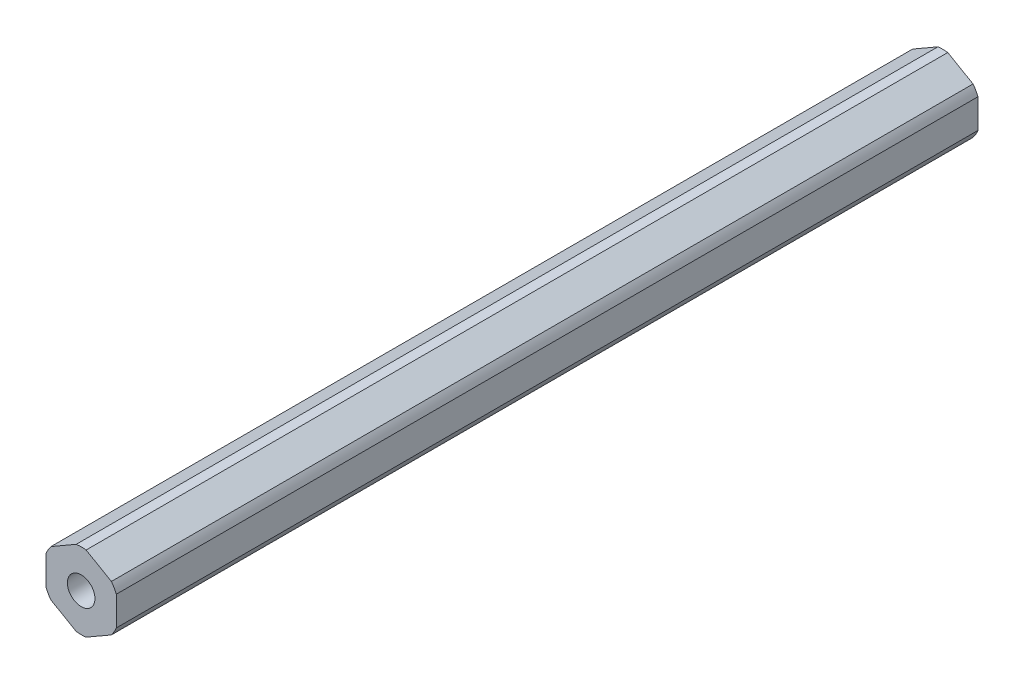
ISO-10303-21;
HEADER;
FILE_DESCRIPTION(('STEP AP214'),'2;1');
FILE_NAME('part.step','',(''),(''),'','','');
FILE_SCHEMA(('AUTOMOTIVE_DESIGN { 1 0 10303 214 1 1 1 1 }'));
ENDSEC;
DATA;
#1=APPLICATION_CONTEXT('core data for automotive mechanical design processes');
#2=APPLICATION_PROTOCOL_DEFINITION('international standard','automotive_design',2000,#1);
#3=PRODUCT_CONTEXT('',#1,'mechanical');
#4=PRODUCT('Part','Part','',(#3));
#5=PRODUCT_RELATED_PRODUCT_CATEGORY('part','',(#4));
#6=PRODUCT_DEFINITION_FORMATION('','',#4);
#7=PRODUCT_DEFINITION_CONTEXT('part definition',#1,'design');
#8=PRODUCT_DEFINITION('design','',#6,#7);
#9=PRODUCT_DEFINITION_SHAPE('','',#8);
#10=(LENGTH_UNIT() NAMED_UNIT(*) SI_UNIT(.MILLI.,.METRE.));
#11=(NAMED_UNIT(*) PLANE_ANGLE_UNIT() SI_UNIT($,.RADIAN.));
#12=(NAMED_UNIT(*) SI_UNIT($,.STERADIAN.) SOLID_ANGLE_UNIT());
#13=UNCERTAINTY_MEASURE_WITH_UNIT(LENGTH_MEASURE(1.E-05),#10,'distance_accuracy_value','');
#14=(GEOMETRIC_REPRESENTATION_CONTEXT(3) GLOBAL_UNCERTAINTY_ASSIGNED_CONTEXT((#13)) GLOBAL_UNIT_ASSIGNED_CONTEXT((#10,
#11,#12)) REPRESENTATION_CONTEXT('',''));
#15=CARTESIAN_POINT('',(0.,0.,0.));
#16=DIRECTION('',(0.,0.,1.));
#17=DIRECTION('',(1.,0.,0.));
#18=AXIS2_PLACEMENT_3D('',#15,#16,#17);
#19=CARTESIAN_POINT('',(0.,0.,-155.575));
#20=DIRECTION('',(0.,0.,1.));
#21=DIRECTION('',(1.,0.,0.));
#22=AXIS2_PLACEMENT_3D('',#19,#20,#21);
#23=CYLINDRICAL_SURFACE('',#22,6.875);
#24=CARTESIAN_POINT('',(0.,0.,0.));
#25=DIRECTION('',(0.,0.,1.));
#26=DIRECTION('',(1.,0.,0.));
#27=AXIS2_PLACEMENT_3D('',#24,#25,#26);
#28=CIRCLE('',#27,6.875);
#29=CARTESIAN_POINT('',(-5.45696050579321,4.18177080173138,0.));
#30=VERTEX_POINT('',#29);
#31=CARTESIAN_POINT('',(-6.35,2.6349810245996,0.));
#32=VERTEX_POINT('',#31);
#33=EDGE_CURVE('E172',#30,#32,#28,.T.);
#34=ORIENTED_EDGE('',*,*,#33,.F.);
#35=DIRECTION('',(0.,0.,1.));
#36=VECTOR('',#35,1.);
#37=CARTESIAN_POINT('',(-5.45696050579321,4.18177080173138,-155.575));
#38=LINE('',#37,#36);
#39=CARTESIAN_POINT('',(-5.45696050579321,4.18177080173138,-155.575));
#40=VERTEX_POINT('',#39);
#41=EDGE_CURVE('E11',#40,#30,#38,.T.);
#42=ORIENTED_EDGE('',*,*,#41,.F.);
#43=CARTESIAN_POINT('',(0.,0.,-155.575));
#44=DIRECTION('',(0.,0.,1.));
#45=DIRECTION('',(1.,0.,0.));
#46=AXIS2_PLACEMENT_3D('',#43,#44,#45);
#47=CIRCLE('',#46,6.875);
#48=CARTESIAN_POINT('',(-6.35,2.6349810245996,-155.575));
#49=VERTEX_POINT('',#48);
#50=EDGE_CURVE('E217',#40,#49,#47,.T.);
#51=ORIENTED_EDGE('',*,*,#50,.T.);
#52=DIRECTION('',(0.,0.,1.));
#53=VECTOR('',#52,1.);
#54=CARTESIAN_POINT('',(-6.35,2.6349810245996,-155.575));
#55=LINE('',#54,#53);
#56=EDGE_CURVE('E48',#49,#32,#55,.T.);
#57=ORIENTED_EDGE('',*,*,#56,.T.);
#58=EDGE_LOOP('',(#34,#42,#51,#57));
#59=FACE_BOUND('',#58,.T.);
#60=ADVANCED_FACE('F45',(#59),#23,.T.);
#61=CARTESIAN_POINT('',(-0.893039494206794,6.81675182633099,-155.575));
#62=DIRECTION('',(-0.500000000000001,0.866025403784438,0.));
#63=DIRECTION('',(-0.866025403784438,-0.500000000000001,0.));
#64=AXIS2_PLACEMENT_3D('',#61,#62,#63);
#65=PLANE('',#64);
#66=DIRECTION('',(-0.866025403784438,-0.500000000000001,0.));
#67=VECTOR('',#66,1.);
#68=CARTESIAN_POINT('',(-0.893039494206794,6.81675182633099,0.));
#69=LINE('',#68,#67);
#70=CARTESIAN_POINT('',(-0.893039494206795,6.81675182633099,0.));
#71=VERTEX_POINT('',#70);
#72=EDGE_CURVE('E214',#71,#30,#69,.T.);
#73=ORIENTED_EDGE('',*,*,#72,.F.);
#74=DIRECTION('',(0.,0.,1.));
#75=VECTOR('',#74,1.);
#76=CARTESIAN_POINT('',(-0.893039494206795,6.81675182633099,-155.575));
#77=LINE('',#76,#75);
#78=CARTESIAN_POINT('',(-0.893039494206795,6.81675182633099,-155.575));
#79=VERTEX_POINT('',#78);
#80=EDGE_CURVE('E55',#79,#71,#77,.T.);
#81=ORIENTED_EDGE('',*,*,#80,.F.);
#82=DIRECTION('',(-0.866025403784438,-0.500000000000001,0.));
#83=VECTOR('',#82,1.);
#84=CARTESIAN_POINT('',(-0.893039494206794,6.81675182633099,-155.575));
#85=LINE('',#84,#83);
#86=EDGE_CURVE('E158',#79,#40,#85,.T.);
#87=ORIENTED_EDGE('',*,*,#86,.T.);
#88=ORIENTED_EDGE('',*,*,#41,.T.);
#89=EDGE_LOOP('',(#73,#81,#87,#88));
#90=FACE_BOUND('',#89,.T.);
#91=ADVANCED_FACE('F247',(#90),#65,.T.);
#92=CARTESIAN_POINT('',(0.,0.,-155.575));
#93=DIRECTION('',(0.,0.,1.));
#94=DIRECTION('',(1.,0.,0.));
#95=AXIS2_PLACEMENT_3D('',#92,#93,#94);
#96=CYLINDRICAL_SURFACE('',#95,6.875);
#97=CARTESIAN_POINT('',(0.,0.,0.));
#98=DIRECTION('',(0.,0.,1.));
#99=DIRECTION('',(1.,0.,0.));
#100=AXIS2_PLACEMENT_3D('',#97,#98,#99);
#101=CIRCLE('',#100,6.875);
#102=CARTESIAN_POINT('',(0.893039494206794,6.81675182633099,0.));
#103=VERTEX_POINT('',#102);
#104=EDGE_CURVE('E144',#103,#71,#101,.T.);
#105=ORIENTED_EDGE('',*,*,#104,.F.);
#106=DIRECTION('',(0.,0.,1.));
#107=VECTOR('',#106,1.);
#108=CARTESIAN_POINT('',(0.893039494206794,6.81675182633099,-155.575));
#109=LINE('',#108,#107);
#110=CARTESIAN_POINT('',(0.893039494206794,6.81675182633099,-155.575));
#111=VERTEX_POINT('',#110);
#112=EDGE_CURVE('E139',#111,#103,#109,.T.);
#113=ORIENTED_EDGE('',*,*,#112,.F.);
#114=CARTESIAN_POINT('',(0.,0.,-155.575));
#115=DIRECTION('',(0.,0.,1.));
#116=DIRECTION('',(1.,0.,0.));
#117=AXIS2_PLACEMENT_3D('',#114,#115,#116);
#118=CIRCLE('',#117,6.875);
#119=EDGE_CURVE('E142',#111,#79,#118,.T.);
#120=ORIENTED_EDGE('',*,*,#119,.T.);
#121=ORIENTED_EDGE('',*,*,#80,.T.);
#122=EDGE_LOOP('',(#105,#113,#120,#121));
#123=FACE_BOUND('',#122,.T.);
#124=ADVANCED_FACE('F141',(#123),#96,.T.);
#125=CARTESIAN_POINT('',(5.45696050579321,4.18177080173139,-155.575));
#126=DIRECTION('',(0.5,0.866025403784439,0.));
#127=DIRECTION('',(-0.866025403784439,0.5,0.));
#128=AXIS2_PLACEMENT_3D('',#125,#126,#127);
#129=PLANE('',#128);
#130=DIRECTION('',(-0.866025403784439,0.5,0.));
#131=VECTOR('',#130,1.);
#132=CARTESIAN_POINT('',(5.45696050579321,4.18177080173139,0.));
#133=LINE('',#132,#131);
#134=CARTESIAN_POINT('',(5.45696050579321,4.18177080173139,0.));
#135=VERTEX_POINT('',#134);
#136=EDGE_CURVE('E209',#135,#103,#133,.T.);
#137=ORIENTED_EDGE('',*,*,#136,.F.);
#138=DIRECTION('',(0.,0.,1.));
#139=VECTOR('',#138,1.);
#140=CARTESIAN_POINT('',(5.45696050579321,4.18177080173139,-155.575));
#141=LINE('',#140,#139);
#142=CARTESIAN_POINT('',(5.45696050579321,4.18177080173139,-155.575));
#143=VERTEX_POINT('',#142);
#144=EDGE_CURVE('E150',#143,#135,#141,.T.);
#145=ORIENTED_EDGE('',*,*,#144,.F.);
#146=DIRECTION('',(-0.866025403784439,0.5,0.));
#147=VECTOR('',#146,1.);
#148=CARTESIAN_POINT('',(5.45696050579321,4.18177080173139,-155.575));
#149=LINE('',#148,#147);
#150=EDGE_CURVE('E156',#143,#111,#149,.T.);
#151=ORIENTED_EDGE('',*,*,#150,.T.);
#152=ORIENTED_EDGE('',*,*,#112,.T.);
#153=EDGE_LOOP('',(#137,#145,#151,#152));
#154=FACE_BOUND('',#153,.T.);
#155=ADVANCED_FACE('F161',(#154),#129,.T.);
#156=CARTESIAN_POINT('',(0.,0.,-155.575));
#157=DIRECTION('',(0.,0.,1.));
#158=DIRECTION('',(1.,0.,0.));
#159=AXIS2_PLACEMENT_3D('',#156,#157,#158);
#160=CYLINDRICAL_SURFACE('',#159,6.875);
#161=CARTESIAN_POINT('',(0.,0.,0.));
#162=DIRECTION('',(0.,0.,1.));
#163=DIRECTION('',(1.,0.,0.));
#164=AXIS2_PLACEMENT_3D('',#161,#162,#163);
#165=CIRCLE('',#164,6.875);
#166=CARTESIAN_POINT('',(6.35,2.6349810245996,0.));
#167=VERTEX_POINT('',#166);
#168=EDGE_CURVE('E205',#167,#135,#165,.T.);
#169=ORIENTED_EDGE('',*,*,#168,.F.);
#170=DIRECTION('',(0.,0.,1.));
#171=VECTOR('',#170,1.);
#172=CARTESIAN_POINT('',(6.35,2.6349810245996,-155.575));
#173=LINE('',#172,#171);
#174=CARTESIAN_POINT('',(6.35,2.6349810245996,-155.575));
#175=VERTEX_POINT('',#174);
#176=EDGE_CURVE('E223',#175,#167,#173,.T.);
#177=ORIENTED_EDGE('',*,*,#176,.F.);
#178=CARTESIAN_POINT('',(0.,0.,-155.575));
#179=DIRECTION('',(0.,0.,1.));
#180=DIRECTION('',(1.,0.,0.));
#181=AXIS2_PLACEMENT_3D('',#178,#179,#180);
#182=CIRCLE('',#181,6.875);
#183=EDGE_CURVE('E163',#175,#143,#182,.T.);
#184=ORIENTED_EDGE('',*,*,#183,.T.);
#185=ORIENTED_EDGE('',*,*,#144,.T.);
#186=EDGE_LOOP('',(#169,#177,#184,#185));
#187=FACE_BOUND('',#186,.T.);
#188=ADVANCED_FACE('F260',(#187),#160,.T.);
#189=CARTESIAN_POINT('',(6.35,-2.6349810245996,-155.575));
#190=DIRECTION('',(1.,0.,0.));
#191=DIRECTION('',(0.,0.,-1.));
#192=AXIS2_PLACEMENT_3D('',#189,#190,#191);
#193=PLANE('',#192);
#194=DIRECTION('',(0.,1.,0.));
#195=VECTOR('',#194,1.);
#196=CARTESIAN_POINT('',(6.35,-2.6349810245996,0.));
#197=LINE('',#196,#195);
#198=CARTESIAN_POINT('',(6.35,-2.6349810245996,0.));
#199=VERTEX_POINT('',#198);
#200=EDGE_CURVE('E201',#199,#167,#197,.T.);
#201=ORIENTED_EDGE('',*,*,#200,.F.);
#202=DIRECTION('',(0.,0.,1.));
#203=VECTOR('',#202,1.);
#204=CARTESIAN_POINT('',(6.35,-2.6349810245996,-155.575));
#205=LINE('',#204,#203);
#206=CARTESIAN_POINT('',(6.35,-2.6349810245996,-155.575));
#207=VERTEX_POINT('',#206);
#208=EDGE_CURVE('E226',#207,#199,#205,.T.);
#209=ORIENTED_EDGE('',*,*,#208,.F.);
#210=DIRECTION('',(0.,1.,0.));
#211=VECTOR('',#210,1.);
#212=CARTESIAN_POINT('',(6.35,-2.6349810245996,-155.575));
#213=LINE('',#212,#211);
#214=EDGE_CURVE('E166',#207,#175,#213,.T.);
#215=ORIENTED_EDGE('',*,*,#214,.T.);
#216=ORIENTED_EDGE('',*,*,#176,.T.);
#217=EDGE_LOOP('',(#201,#209,#215,#216));
#218=FACE_BOUND('',#217,.T.);
#219=ADVANCED_FACE('F263',(#218),#193,.T.);
#220=CARTESIAN_POINT('',(0.,0.,-155.575));
#221=DIRECTION('',(0.,0.,1.));
#222=DIRECTION('',(1.,0.,0.));
#223=AXIS2_PLACEMENT_3D('',#220,#221,#222);
#224=CYLINDRICAL_SURFACE('',#223,6.875);
#225=CARTESIAN_POINT('',(0.,0.,0.));
#226=DIRECTION('',(0.,0.,1.));
#227=DIRECTION('',(1.,0.,0.));
#228=AXIS2_PLACEMENT_3D('',#225,#226,#227);
#229=CIRCLE('',#228,6.875);
#230=CARTESIAN_POINT('',(5.45696050579321,-4.18177080173139,0.));
#231=VERTEX_POINT('',#230);
#232=EDGE_CURVE('E197',#231,#199,#229,.T.);
#233=ORIENTED_EDGE('',*,*,#232,.F.);
#234=DIRECTION('',(0.,0.,1.));
#235=VECTOR('',#234,1.);
#236=CARTESIAN_POINT('',(5.45696050579321,-4.18177080173139,-155.575));
#237=LINE('',#236,#235);
#238=CARTESIAN_POINT('',(5.45696050579321,-4.18177080173139,-155.575));
#239=VERTEX_POINT('',#238);
#240=EDGE_CURVE('E229',#239,#231,#237,.T.);
#241=ORIENTED_EDGE('',*,*,#240,.F.);
#242=CARTESIAN_POINT('',(0.,0.,-155.575));
#243=DIRECTION('',(0.,0.,1.));
#244=DIRECTION('',(1.,0.,0.));
#245=AXIS2_PLACEMENT_3D('',#242,#243,#244);
#246=CIRCLE('',#245,6.875);
#247=EDGE_CURVE('E334',#239,#207,#246,.T.);
#248=ORIENTED_EDGE('',*,*,#247,.T.);
#249=ORIENTED_EDGE('',*,*,#208,.T.);
#250=EDGE_LOOP('',(#233,#241,#248,#249));
#251=FACE_BOUND('',#250,.T.);
#252=ADVANCED_FACE('F267',(#251),#224,.T.);
#253=CARTESIAN_POINT('',(0.893039494206801,-6.81675182633099,-155.575));
#254=DIRECTION('',(0.5,-0.866025403784439,0.));
#255=DIRECTION('',(0.866025403784439,0.5,0.));
#256=AXIS2_PLACEMENT_3D('',#253,#254,#255);
#257=PLANE('',#256);
#258=DIRECTION('',(0.866025403784438,0.5,0.));
#259=VECTOR('',#258,1.);
#260=CARTESIAN_POINT('',(0.893039494206801,-6.81675182633099,0.));
#261=LINE('',#260,#259);
#262=CARTESIAN_POINT('',(0.893039494206797,-6.81675182633099,0.));
#263=VERTEX_POINT('',#262);
#264=EDGE_CURVE('E193',#263,#231,#261,.T.);
#265=ORIENTED_EDGE('',*,*,#264,.F.);
#266=DIRECTION('',(0.,0.,1.));
#267=VECTOR('',#266,1.);
#268=CARTESIAN_POINT('',(0.893039494206797,-6.81675182633099,-155.575));
#269=LINE('',#268,#267);
#270=CARTESIAN_POINT('',(0.893039494206797,-6.81675182633099,-155.575));
#271=VERTEX_POINT('',#270);
#272=EDGE_CURVE('E232',#271,#263,#269,.T.);
#273=ORIENTED_EDGE('',*,*,#272,.F.);
#274=DIRECTION('',(0.866025403784438,0.5,0.));
#275=VECTOR('',#274,1.);
#276=CARTESIAN_POINT('',(0.893039494206801,-6.81675182633099,-155.575));
#277=LINE('',#276,#275);
#278=EDGE_CURVE('E330',#271,#239,#277,.T.);
#279=ORIENTED_EDGE('',*,*,#278,.T.);
#280=ORIENTED_EDGE('',*,*,#240,.T.);
#281=EDGE_LOOP('',(#265,#273,#279,#280));
#282=FACE_BOUND('',#281,.T.);
#283=ADVANCED_FACE('F271',(#282),#257,.T.);
#284=CARTESIAN_POINT('',(0.,0.,-155.575));
#285=DIRECTION('',(0.,0.,1.));
#286=DIRECTION('',(1.,0.,0.));
#287=AXIS2_PLACEMENT_3D('',#284,#285,#286);
#288=CYLINDRICAL_SURFACE('',#287,6.875);
#289=CARTESIAN_POINT('',(0.,0.,0.));
#290=DIRECTION('',(0.,0.,1.));
#291=DIRECTION('',(1.,0.,0.));
#292=AXIS2_PLACEMENT_3D('',#289,#290,#291);
#293=CIRCLE('',#292,6.875);
#294=CARTESIAN_POINT('',(-0.893039494206784,-6.81675182633099,0.));
#295=VERTEX_POINT('',#294);
#296=EDGE_CURVE('E189',#295,#263,#293,.T.);
#297=ORIENTED_EDGE('',*,*,#296,.F.);
#298=DIRECTION('',(0.,0.,1.));
#299=VECTOR('',#298,1.);
#300=CARTESIAN_POINT('',(-0.893039494206784,-6.81675182633099,-155.575));
#301=LINE('',#300,#299);
#302=CARTESIAN_POINT('',(-0.893039494206784,-6.81675182633099,-155.575));
#303=VERTEX_POINT('',#302);
#304=EDGE_CURVE('E235',#303,#295,#301,.T.);
#305=ORIENTED_EDGE('',*,*,#304,.F.);
#306=CARTESIAN_POINT('',(0.,0.,-155.575));
#307=DIRECTION('',(0.,0.,1.));
#308=DIRECTION('',(1.,0.,0.));
#309=AXIS2_PLACEMENT_3D('',#306,#307,#308);
#310=CIRCLE('',#309,6.875);
#311=EDGE_CURVE('E326',#303,#271,#310,.T.);
#312=ORIENTED_EDGE('',*,*,#311,.T.);
#313=ORIENTED_EDGE('',*,*,#272,.T.);
#314=EDGE_LOOP('',(#297,#305,#312,#313));
#315=FACE_BOUND('',#314,.T.);
#316=ADVANCED_FACE('F275',(#315),#288,.T.);
#317=CARTESIAN_POINT('',(-5.45696050579321,-4.18177080173138,-155.575));
#318=DIRECTION('',(-0.5,-0.866025403784439,0.));
#319=DIRECTION('',(0.866025403784439,-0.5,0.));
#320=AXIS2_PLACEMENT_3D('',#317,#318,#319);
#321=PLANE('',#320);
#322=DIRECTION('',(0.866025403784439,-0.5,0.));
#323=VECTOR('',#322,1.);
#324=CARTESIAN_POINT('',(-5.45696050579321,-4.18177080173138,0.));
#325=LINE('',#324,#323);
#326=CARTESIAN_POINT('',(-5.45696050579321,-4.18177080173138,0.));
#327=VERTEX_POINT('',#326);
#328=EDGE_CURVE('E185',#327,#295,#325,.T.);
#329=ORIENTED_EDGE('',*,*,#328,.F.);
#330=DIRECTION('',(0.,0.,1.));
#331=VECTOR('',#330,1.);
#332=CARTESIAN_POINT('',(-5.45696050579321,-4.18177080173138,-155.575));
#333=LINE('',#332,#331);
#334=CARTESIAN_POINT('',(-5.45696050579321,-4.18177080173138,-155.575));
#335=VERTEX_POINT('',#334);
#336=EDGE_CURVE('E238',#335,#327,#333,.T.);
#337=ORIENTED_EDGE('',*,*,#336,.F.);
#338=DIRECTION('',(0.866025403784439,-0.5,0.));
#339=VECTOR('',#338,1.);
#340=CARTESIAN_POINT('',(-5.45696050579321,-4.18177080173138,-155.575));
#341=LINE('',#340,#339);
#342=EDGE_CURVE('E322',#335,#303,#341,.T.);
#343=ORIENTED_EDGE('',*,*,#342,.T.);
#344=ORIENTED_EDGE('',*,*,#304,.T.);
#345=EDGE_LOOP('',(#329,#337,#343,#344));
#346=FACE_BOUND('',#345,.T.);
#347=ADVANCED_FACE('F279',(#346),#321,.T.);
#348=CARTESIAN_POINT('',(0.,0.,-155.575));
#349=DIRECTION('',(0.,0.,1.));
#350=DIRECTION('',(1.,0.,0.));
#351=AXIS2_PLACEMENT_3D('',#348,#349,#350);
#352=CYLINDRICAL_SURFACE('',#351,6.875);
#353=CARTESIAN_POINT('',(0.,0.,0.));
#354=DIRECTION('',(0.,0.,1.));
#355=DIRECTION('',(1.,0.,0.));
#356=AXIS2_PLACEMENT_3D('',#353,#354,#355);
#357=CIRCLE('',#356,6.875);
#358=CARTESIAN_POINT('',(-6.35,-2.6349810245996,0.));
#359=VERTEX_POINT('',#358);
#360=EDGE_CURVE('E181',#359,#327,#357,.T.);
#361=ORIENTED_EDGE('',*,*,#360,.F.);
#362=DIRECTION('',(0.,0.,1.));
#363=VECTOR('',#362,1.);
#364=CARTESIAN_POINT('',(-6.35,-2.6349810245996,-155.575));
#365=LINE('',#364,#363);
#366=CARTESIAN_POINT('',(-6.35,-2.6349810245996,-155.575));
#367=VERTEX_POINT('',#366);
#368=EDGE_CURVE('E240',#367,#359,#365,.T.);
#369=ORIENTED_EDGE('',*,*,#368,.F.);
#370=CARTESIAN_POINT('',(0.,0.,-155.575));
#371=DIRECTION('',(0.,0.,1.));
#372=DIRECTION('',(1.,0.,0.));
#373=AXIS2_PLACEMENT_3D('',#370,#371,#372);
#374=CIRCLE('',#373,6.875);
#375=EDGE_CURVE('E318',#367,#335,#374,.T.);
#376=ORIENTED_EDGE('',*,*,#375,.T.);
#377=ORIENTED_EDGE('',*,*,#336,.T.);
#378=EDGE_LOOP('',(#361,#369,#376,#377));
#379=FACE_BOUND('',#378,.T.);
#380=ADVANCED_FACE('F283',(#379),#352,.T.);
#381=CARTESIAN_POINT('',(-6.35,2.6349810245996,-155.575));
#382=DIRECTION('',(-1.,0.,0.));
#383=DIRECTION('',(0.,0.,1.));
#384=AXIS2_PLACEMENT_3D('',#381,#382,#383);
#385=PLANE('',#384);
#386=DIRECTION('',(0.,-1.,0.));
#387=VECTOR('',#386,1.);
#388=CARTESIAN_POINT('',(-6.35,2.6349810245996,0.));
#389=LINE('',#388,#387);
#390=EDGE_CURVE('E176',#32,#359,#389,.T.);
#391=ORIENTED_EDGE('',*,*,#390,.F.);
#392=ORIENTED_EDGE('',*,*,#56,.F.);
#393=DIRECTION('',(0.,-1.,0.));
#394=VECTOR('',#393,1.);
#395=CARTESIAN_POINT('',(-6.35,2.6349810245996,-155.575));
#396=LINE('',#395,#394);
#397=EDGE_CURVE('E315',#49,#367,#396,.T.);
#398=ORIENTED_EDGE('',*,*,#397,.T.);
#399=ORIENTED_EDGE('',*,*,#368,.T.);
#400=EDGE_LOOP('',(#391,#392,#398,#399));
#401=FACE_BOUND('',#400,.T.);
#402=ADVANCED_FACE('F244',(#401),#385,.T.);
#403=CARTESIAN_POINT('',(0.,0.,-155.575));
#404=DIRECTION('',(0.,0.,1.));
#405=DIRECTION('',(1.,0.,0.));
#406=AXIS2_PLACEMENT_3D('',#403,#404,#405);
#407=PLANE('',#406);
#408=CARTESIAN_POINT('',(0.,0.,-155.575));
#409=DIRECTION('',(0.,0.,1.));
#410=DIRECTION('',(1.,0.,0.));
#411=AXIS2_PLACEMENT_3D('',#408,#409,#410);
#412=CIRCLE('',#411,2.4892);
#413=CARTESIAN_POINT('',(2.4892,0.,-155.575));
#414=VERTEX_POINT('',#413);
#415=EDGE_CURVE('E177',#414,#414,#412,.T.);
#416=ORIENTED_EDGE('',*,*,#415,.T.);
#417=EDGE_LOOP('',(#416));
#418=FACE_BOUND('',#417,.T.);
#419=ORIENTED_EDGE('',*,*,#50,.F.);
#420=ORIENTED_EDGE('',*,*,#86,.F.);
#421=ORIENTED_EDGE('',*,*,#119,.F.);
#422=ORIENTED_EDGE('',*,*,#150,.F.);
#423=ORIENTED_EDGE('',*,*,#183,.F.);
#424=ORIENTED_EDGE('',*,*,#214,.F.);
#425=ORIENTED_EDGE('',*,*,#247,.F.);
#426=ORIENTED_EDGE('',*,*,#278,.F.);
#427=ORIENTED_EDGE('',*,*,#311,.F.);
#428=ORIENTED_EDGE('',*,*,#342,.F.);
#429=ORIENTED_EDGE('',*,*,#375,.F.);
#430=ORIENTED_EDGE('',*,*,#397,.F.);
#431=EDGE_LOOP('',(#419,#420,#421,#422,#423,#424,#425,#426,#427,#428,#429,#430));
#432=FACE_BOUND('',#431,.T.);
#433=ADVANCED_FACE('F154',(#418,#432),#407,.F.);
#434=CARTESIAN_POINT('',(0.,0.,0.));
#435=DIRECTION('',(0.,0.,1.));
#436=DIRECTION('',(1.,0.,0.));
#437=AXIS2_PLACEMENT_3D('',#434,#435,#436);
#438=PLANE('',#437);
#439=CARTESIAN_POINT('',(0.,0.,0.));
#440=DIRECTION('',(0.,0.,1.));
#441=DIRECTION('',(1.,0.,0.));
#442=AXIS2_PLACEMENT_3D('',#439,#440,#441);
#443=CIRCLE('',#442,2.4892);
#444=CARTESIAN_POINT('',(2.4892,0.,0.));
#445=VERTEX_POINT('',#444);
#446=EDGE_CURVE('E307',#445,#445,#443,.T.);
#447=ORIENTED_EDGE('',*,*,#446,.F.);
#448=EDGE_LOOP('',(#447));
#449=FACE_BOUND('',#448,.T.);
#450=ORIENTED_EDGE('',*,*,#33,.T.);
#451=ORIENTED_EDGE('',*,*,#390,.T.);
#452=ORIENTED_EDGE('',*,*,#360,.T.);
#453=ORIENTED_EDGE('',*,*,#328,.T.);
#454=ORIENTED_EDGE('',*,*,#296,.T.);
#455=ORIENTED_EDGE('',*,*,#264,.T.);
#456=ORIENTED_EDGE('',*,*,#232,.T.);
#457=ORIENTED_EDGE('',*,*,#200,.T.);
#458=ORIENTED_EDGE('',*,*,#168,.T.);
#459=ORIENTED_EDGE('',*,*,#136,.T.);
#460=ORIENTED_EDGE('',*,*,#104,.T.);
#461=ORIENTED_EDGE('',*,*,#72,.T.);
#462=EDGE_LOOP('',(#450,#451,#452,#453,#454,#455,#456,#457,#458,#459,#460,#461));
#463=FACE_BOUND('',#462,.T.);
#464=ADVANCED_FACE('F246',(#449,#463),#438,.T.);
#465=CARTESIAN_POINT('',(0.,0.,-155.575));
#466=DIRECTION('',(0.,0.,1.));
#467=DIRECTION('',(1.,0.,0.));
#468=AXIS2_PLACEMENT_3D('',#465,#466,#467);
#469=CYLINDRICAL_SURFACE('',#468,2.4892);
#470=ORIENTED_EDGE('',*,*,#415,.F.);
#471=EDGE_LOOP('',(#470));
#472=FACE_BOUND('',#471,.T.);
#473=ORIENTED_EDGE('',*,*,#446,.T.);
#474=EDGE_LOOP('',(#473));
#475=FACE_BOUND('',#474,.T.);
#476=ADVANCED_FACE('F295',(#472,#475),#469,.F.);
#477=CLOSED_SHELL('',(#60,#91,#124,#155,#188,#219,#252,#283,#316,#347,#380,#402,#433,#464,#476));
#478=MANIFOLD_SOLID_BREP('B2',#477);
#479=ADVANCED_BREP_SHAPE_REPRESENTATION('',(#18,#478),#14);
#480=SHAPE_DEFINITION_REPRESENTATION(#9,#479);
ENDSEC;
END-ISO-10303-21;
